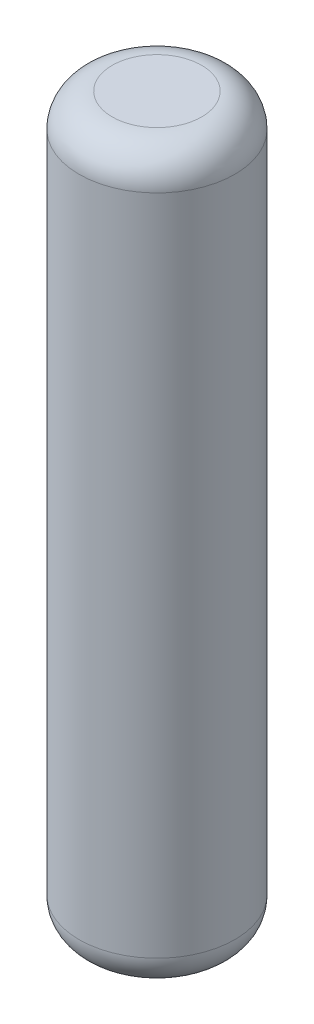
ISO-10303-21;
HEADER;
FILE_DESCRIPTION(('STEP AP214'),'2;1');
FILE_NAME('part.step','',(''),(''),'','','');
FILE_SCHEMA(('AUTOMOTIVE_DESIGN { 1 0 10303 214 1 1 1 1 }'));
ENDSEC;
DATA;
#1=APPLICATION_CONTEXT('core data for automotive mechanical design processes');
#2=APPLICATION_PROTOCOL_DEFINITION('international standard','automotive_design',2000,#1);
#3=PRODUCT_CONTEXT('',#1,'mechanical');
#4=PRODUCT('Part','Part','',(#3));
#5=PRODUCT_RELATED_PRODUCT_CATEGORY('part','',(#4));
#6=PRODUCT_DEFINITION_FORMATION('','',#4);
#7=PRODUCT_DEFINITION_CONTEXT('part definition',#1,'design');
#8=PRODUCT_DEFINITION('design','',#6,#7);
#9=PRODUCT_DEFINITION_SHAPE('','',#8);
#10=(LENGTH_UNIT() NAMED_UNIT(*) SI_UNIT(.MILLI.,.METRE.));
#11=(NAMED_UNIT(*) PLANE_ANGLE_UNIT() SI_UNIT($,.RADIAN.));
#12=(NAMED_UNIT(*) SI_UNIT($,.STERADIAN.) SOLID_ANGLE_UNIT());
#13=UNCERTAINTY_MEASURE_WITH_UNIT(LENGTH_MEASURE(1.E-05),#10,'distance_accuracy_value','');
#14=(GEOMETRIC_REPRESENTATION_CONTEXT(3) GLOBAL_UNCERTAINTY_ASSIGNED_CONTEXT((#13)) GLOBAL_UNIT_ASSIGNED_CONTEXT((#10,
#11,#12)) REPRESENTATION_CONTEXT('',''));
#15=CARTESIAN_POINT('',(0.,0.,0.));
#16=DIRECTION('',(0.,0.,1.));
#17=DIRECTION('',(1.,0.,0.));
#18=AXIS2_PLACEMENT_3D('',#15,#16,#17);
#19=CARTESIAN_POINT('',(0.,22.,0.));
#20=DIRECTION('',(0.,-1.,0.));
#21=DIRECTION('',(0.,0.,-1.));
#22=AXIS2_PLACEMENT_3D('',#19,#20,#21);
#23=CYLINDRICAL_SURFACE('',#22,2.35);
#24=CARTESIAN_POINT('',(0.,1.,0.));
#25=DIRECTION('',(0.,1.,0.));
#26=DIRECTION('',(0.,0.,1.));
#27=AXIS2_PLACEMENT_3D('',#24,#25,#26);
#28=CIRCLE('',#27,2.35);
#29=CARTESIAN_POINT('',(0.,1.,2.35));
#30=VERTEX_POINT('',#29);
#31=EDGE_CURVE('E52',#30,#30,#28,.T.);
#32=ORIENTED_EDGE('',*,*,#31,.T.);
#33=EDGE_LOOP('',(#32));
#34=FACE_BOUND('',#33,.T.);
#35=CARTESIAN_POINT('',(0.,21.,0.));
#36=DIRECTION('',(0.,1.,0.));
#37=DIRECTION('',(0.,0.,1.));
#38=AXIS2_PLACEMENT_3D('',#35,#36,#37);
#39=CIRCLE('',#38,2.35);
#40=CARTESIAN_POINT('',(0.,21.,2.35));
#41=VERTEX_POINT('',#40);
#42=EDGE_CURVE('E56',#41,#41,#39,.F.);
#43=ORIENTED_EDGE('',*,*,#42,.T.);
#44=EDGE_LOOP('',(#43));
#45=FACE_BOUND('',#44,.T.);
#46=ADVANCED_FACE('F41',(#34,#45),#23,.T.);
#47=CARTESIAN_POINT('',(0.,22.,0.));
#48=DIRECTION('',(0.,1.,0.));
#49=DIRECTION('',(0.,0.,1.));
#50=AXIS2_PLACEMENT_3D('',#47,#48,#49);
#51=PLANE('',#50);
#52=CARTESIAN_POINT('',(0.,22.,0.));
#53=DIRECTION('',(0.,1.,0.));
#54=DIRECTION('',(0.,0.,1.));
#55=AXIS2_PLACEMENT_3D('',#52,#53,#54);
#56=CIRCLE('',#55,1.35);
#57=CARTESIAN_POINT('',(0.,22.,1.35));
#58=VERTEX_POINT('',#57);
#59=EDGE_CURVE('E10',#58,#58,#56,.T.);
#60=ORIENTED_EDGE('',*,*,#59,.T.);
#61=EDGE_LOOP('',(#60));
#62=FACE_BOUND('',#61,.T.);
#63=ADVANCED_FACE('F72',(#62),#51,.T.);
#64=CARTESIAN_POINT('',(0.,0.,0.));
#65=DIRECTION('',(0.,1.,0.));
#66=DIRECTION('',(0.,0.,1.));
#67=AXIS2_PLACEMENT_3D('',#64,#65,#66);
#68=PLANE('',#67);
#69=CARTESIAN_POINT('',(0.,0.,0.));
#70=DIRECTION('',(0.,1.,0.));
#71=DIRECTION('',(0.,0.,1.));
#72=AXIS2_PLACEMENT_3D('',#69,#70,#71);
#73=CIRCLE('',#72,1.35);
#74=CARTESIAN_POINT('',(0.,0.,1.35));
#75=VERTEX_POINT('',#74);
#76=EDGE_CURVE('E48',#75,#75,#73,.F.);
#77=ORIENTED_EDGE('',*,*,#76,.T.);
#78=EDGE_LOOP('',(#77));
#79=FACE_BOUND('',#78,.T.);
#80=ADVANCED_FACE('F69',(#79),#68,.F.);
#81=CARTESIAN_POINT('',(0.,1.,0.));
#82=DIRECTION('',(0.,1.,0.));
#83=DIRECTION('',(0.,0.,1.));
#84=AXIS2_PLACEMENT_3D('',#81,#82,#83);
#85=TOROIDAL_SURFACE('',#84,1.35,1.);
#86=ORIENTED_EDGE('',*,*,#76,.F.);
#87=EDGE_LOOP('',(#86));
#88=FACE_BOUND('',#87,.T.);
#89=ORIENTED_EDGE('',*,*,#31,.F.);
#90=EDGE_LOOP('',(#89));
#91=FACE_BOUND('',#90,.T.);
#92=ADVANCED_FACE('F65',(#88,#91),#85,.T.);
#93=CARTESIAN_POINT('',(0.,21.,0.));
#94=DIRECTION('',(0.,1.,0.));
#95=DIRECTION('',(0.,0.,1.));
#96=AXIS2_PLACEMENT_3D('',#93,#94,#95);
#97=TOROIDAL_SURFACE('',#96,1.35,1.);
#98=ORIENTED_EDGE('',*,*,#42,.F.);
#99=EDGE_LOOP('',(#98));
#100=FACE_BOUND('',#99,.T.);
#101=ORIENTED_EDGE('',*,*,#59,.F.);
#102=EDGE_LOOP('',(#101));
#103=FACE_BOUND('',#102,.T.);
#104=ADVANCED_FACE('F43',(#100,#103),#97,.T.);
#105=CLOSED_SHELL('',(#46,#63,#80,#92,#104));
#106=MANIFOLD_SOLID_BREP('B2',#105);
#107=ADVANCED_BREP_SHAPE_REPRESENTATION('',(#18,#106),#14);
#108=SHAPE_DEFINITION_REPRESENTATION(#9,#107);
ENDSEC;
END-ISO-10303-21;
